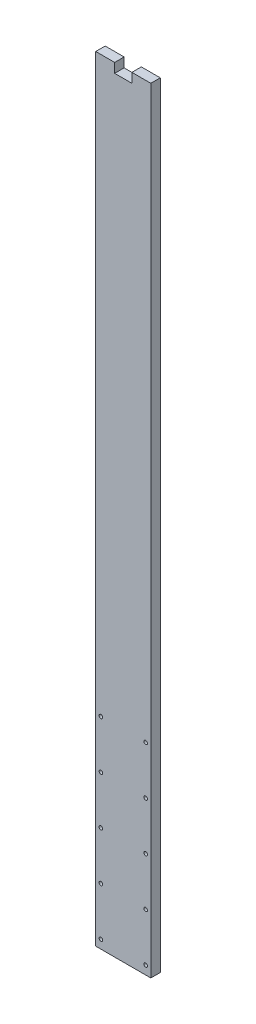
ISO-10303-21;
HEADER;
FILE_DESCRIPTION(('STEP AP214'),'2;1');
FILE_NAME('part.step','',(''),(''),'','','');
FILE_SCHEMA(('AUTOMOTIVE_DESIGN { 1 0 10303 214 1 1 1 1 }'));
ENDSEC;
DATA;
#1=APPLICATION_CONTEXT('core data for automotive mechanical design processes');
#2=APPLICATION_PROTOCOL_DEFINITION('international standard','automotive_design',2000,#1);
#3=PRODUCT_CONTEXT('',#1,'mechanical');
#4=PRODUCT('Part','Part','',(#3));
#5=PRODUCT_RELATED_PRODUCT_CATEGORY('part','',(#4));
#6=PRODUCT_DEFINITION_FORMATION('','',#4);
#7=PRODUCT_DEFINITION_CONTEXT('part definition',#1,'design');
#8=PRODUCT_DEFINITION('design','',#6,#7);
#9=PRODUCT_DEFINITION_SHAPE('','',#8);
#10=(LENGTH_UNIT() NAMED_UNIT(*) SI_UNIT(.MILLI.,.METRE.));
#11=(NAMED_UNIT(*) PLANE_ANGLE_UNIT() SI_UNIT($,.RADIAN.));
#12=(NAMED_UNIT(*) SI_UNIT($,.STERADIAN.) SOLID_ANGLE_UNIT());
#13=UNCERTAINTY_MEASURE_WITH_UNIT(LENGTH_MEASURE(1.E-05),#10,'distance_accuracy_value','');
#14=(GEOMETRIC_REPRESENTATION_CONTEXT(3) GLOBAL_UNCERTAINTY_ASSIGNED_CONTEXT((#13)) GLOBAL_UNIT_ASSIGNED_CONTEXT((#10,
#11,#12)) REPRESENTATION_CONTEXT('',''));
#15=CARTESIAN_POINT('',(0.,0.,0.));
#16=DIRECTION('',(0.,0.,1.));
#17=DIRECTION('',(1.,0.,0.));
#18=AXIS2_PLACEMENT_3D('',#15,#16,#17);
#19=CARTESIAN_POINT('',(0.,450.,5.5));
#20=DIRECTION('',(0.,-1.,0.));
#21=DIRECTION('',(0.,0.,-1.));
#22=AXIS2_PLACEMENT_3D('',#19,#20,#21);
#23=PLANE('',#22);
#24=DIRECTION('',(-1.,0.,0.));
#25=VECTOR('',#24,1.);
#26=CARTESIAN_POINT('',(0.,450.,0.));
#27=LINE('',#26,#25);
#28=CARTESIAN_POINT('',(32.,450.,0.));
#29=VERTEX_POINT('',#28);
#30=CARTESIAN_POINT('',(20.9999999999999,450.,0.));
#31=VERTEX_POINT('',#30);
#32=EDGE_CURVE('E126',#29,#31,#27,.T.);
#33=ORIENTED_EDGE('',*,*,#32,.T.);
#34=DIRECTION('',(0.,0.,1.));
#35=VECTOR('',#34,1.);
#36=CARTESIAN_POINT('',(20.9999999999999,450.,0.));
#37=LINE('',#36,#35);
#38=CARTESIAN_POINT('',(20.9999999999999,450.,5.5));
#39=VERTEX_POINT('',#38);
#40=EDGE_CURVE('E110',#31,#39,#37,.T.);
#41=ORIENTED_EDGE('',*,*,#40,.T.);
#42=DIRECTION('',(-1.,0.,0.));
#43=VECTOR('',#42,1.);
#44=CARTESIAN_POINT('',(0.,450.,5.5));
#45=LINE('',#44,#43);
#46=CARTESIAN_POINT('',(32.,450.,5.5));
#47=VERTEX_POINT('',#46);
#48=EDGE_CURVE('E143',#47,#39,#45,.T.);
#49=ORIENTED_EDGE('',*,*,#48,.F.);
#50=DIRECTION('',(0.,0.,-1.));
#51=VECTOR('',#50,1.);
#52=CARTESIAN_POINT('',(32.,450.,5.5));
#53=LINE('',#52,#51);
#54=EDGE_CURVE('E133',#47,#29,#53,.T.);
#55=ORIENTED_EDGE('',*,*,#54,.T.);
#56=EDGE_LOOP('',(#33,#41,#49,#55));
#57=FACE_BOUND('',#56,.T.);
#58=ADVANCED_FACE('F33',(#57),#23,.F.);
#59=CARTESIAN_POINT('',(0.,0.,5.5));
#60=DIRECTION('',(1.,0.,0.));
#61=DIRECTION('',(0.,0.,-1.));
#62=AXIS2_PLACEMENT_3D('',#59,#60,#61);
#63=PLANE('',#62);
#64=DIRECTION('',(0.,-1.,0.));
#65=VECTOR('',#64,1.);
#66=CARTESIAN_POINT('',(0.,0.,0.));
#67=LINE('',#66,#65);
#68=CARTESIAN_POINT('',(0.,450.,0.));
#69=VERTEX_POINT('',#68);
#70=CARTESIAN_POINT('',(0.,0.,0.));
#71=VERTEX_POINT('',#70);
#72=EDGE_CURVE('E189',#69,#71,#67,.T.);
#73=ORIENTED_EDGE('',*,*,#72,.T.);
#74=DIRECTION('',(0.,0.,-1.));
#75=VECTOR('',#74,1.);
#76=CARTESIAN_POINT('',(0.,0.,5.5));
#77=LINE('',#76,#75);
#78=CARTESIAN_POINT('',(0.,0.,5.5));
#79=VERTEX_POINT('',#78);
#80=EDGE_CURVE('E11',#79,#71,#77,.T.);
#81=ORIENTED_EDGE('',*,*,#80,.F.);
#82=DIRECTION('',(0.,-1.,0.));
#83=VECTOR('',#82,1.);
#84=CARTESIAN_POINT('',(0.,0.,5.5));
#85=LINE('',#84,#83);
#86=CARTESIAN_POINT('',(0.,450.,5.5));
#87=VERTEX_POINT('',#86);
#88=EDGE_CURVE('E134',#87,#79,#85,.T.);
#89=ORIENTED_EDGE('',*,*,#88,.F.);
#90=DIRECTION('',(0.,0.,-1.));
#91=VECTOR('',#90,1.);
#92=CARTESIAN_POINT('',(0.,450.,5.5));
#93=LINE('',#92,#91);
#94=EDGE_CURVE('E141',#87,#69,#93,.T.);
#95=ORIENTED_EDGE('',*,*,#94,.T.);
#96=EDGE_LOOP('',(#73,#81,#89,#95));
#97=FACE_BOUND('',#96,.T.);
#98=ADVANCED_FACE('F35',(#97),#63,.F.);
#99=CARTESIAN_POINT('',(0.,0.,5.5));
#100=DIRECTION('',(0.,1.,0.));
#101=DIRECTION('',(0.,0.,1.));
#102=AXIS2_PLACEMENT_3D('',#99,#100,#101);
#103=PLANE('',#102);
#104=DIRECTION('',(1.,0.,0.));
#105=VECTOR('',#104,1.);
#106=CARTESIAN_POINT('',(0.,0.,0.));
#107=LINE('',#106,#105);
#108=CARTESIAN_POINT('',(32.,0.,0.));
#109=VERTEX_POINT('',#108);
#110=EDGE_CURVE('E198',#71,#109,#107,.T.);
#111=ORIENTED_EDGE('',*,*,#110,.T.);
#112=DIRECTION('',(0.,0.,-1.));
#113=VECTOR('',#112,1.);
#114=CARTESIAN_POINT('',(32.,0.,5.5));
#115=LINE('',#114,#113);
#116=CARTESIAN_POINT('',(32.,0.,5.5));
#117=VERTEX_POINT('',#116);
#118=EDGE_CURVE('E42',#117,#109,#115,.T.);
#119=ORIENTED_EDGE('',*,*,#118,.F.);
#120=DIRECTION('',(1.,0.,0.));
#121=VECTOR('',#120,1.);
#122=CARTESIAN_POINT('',(0.,0.,5.5));
#123=LINE('',#122,#121);
#124=EDGE_CURVE('E88',#79,#117,#123,.T.);
#125=ORIENTED_EDGE('',*,*,#124,.F.);
#126=ORIENTED_EDGE('',*,*,#80,.T.);
#127=EDGE_LOOP('',(#111,#119,#125,#126));
#128=FACE_BOUND('',#127,.T.);
#129=ADVANCED_FACE('F204',(#128),#103,.F.);
#130=CARTESIAN_POINT('',(32.,0.,5.5));
#131=DIRECTION('',(-1.,0.,0.));
#132=DIRECTION('',(0.,0.,1.));
#133=AXIS2_PLACEMENT_3D('',#130,#131,#132);
#134=PLANE('',#133);
#135=DIRECTION('',(0.,1.,0.));
#136=VECTOR('',#135,1.);
#137=CARTESIAN_POINT('',(32.,0.,0.));
#138=LINE('',#137,#136);
#139=EDGE_CURVE('E137',#109,#29,#138,.T.);
#140=ORIENTED_EDGE('',*,*,#139,.T.);
#141=ORIENTED_EDGE('',*,*,#54,.F.);
#142=DIRECTION('',(0.,1.,0.));
#143=VECTOR('',#142,1.);
#144=CARTESIAN_POINT('',(32.,0.,5.5));
#145=LINE('',#144,#143);
#146=EDGE_CURVE('E194',#117,#47,#145,.T.);
#147=ORIENTED_EDGE('',*,*,#146,.F.);
#148=ORIENTED_EDGE('',*,*,#118,.T.);
#149=EDGE_LOOP('',(#140,#141,#147,#148));
#150=FACE_BOUND('',#149,.T.);
#151=ADVANCED_FACE('F200',(#150),#134,.F.);
#152=CARTESIAN_POINT('',(10.9999999999999,450.,5.5));
#153=VERTEX_POINT('',#152);
#154=EDGE_CURVE('E59',#153,#87,#45,.T.);
#155=ORIENTED_EDGE('',*,*,#154,.F.);
#156=DIRECTION('',(0.,0.,1.));
#157=VECTOR('',#156,1.);
#158=CARTESIAN_POINT('',(10.9999999999999,450.,0.));
#159=LINE('',#158,#157);
#160=CARTESIAN_POINT('',(10.9999999999999,450.,0.));
#161=VERTEX_POINT('',#160);
#162=EDGE_CURVE('E120',#161,#153,#159,.T.);
#163=ORIENTED_EDGE('',*,*,#162,.F.);
#164=EDGE_CURVE('E81',#161,#69,#27,.T.);
#165=ORIENTED_EDGE('',*,*,#164,.T.);
#166=ORIENTED_EDGE('',*,*,#94,.F.);
#167=EDGE_LOOP('',(#155,#163,#165,#166));
#168=FACE_BOUND('',#167,.T.);
#169=ADVANCED_FACE('F207',(#168),#23,.F.);
#170=CARTESIAN_POINT('',(0.,0.,5.5));
#171=DIRECTION('',(0.,0.,-1.));
#172=DIRECTION('',(-1.,0.,0.));
#173=AXIS2_PLACEMENT_3D('',#170,#171,#172);
#174=PLANE('',#173);
#175=CARTESIAN_POINT('',(29.,61.,5.5));
#176=DIRECTION('',(0.,0.,1.));
#177=DIRECTION('',(1.,0.,0.));
#178=AXIS2_PLACEMENT_3D('',#175,#176,#177);
#179=CIRCLE('',#178,1.05);
#180=CARTESIAN_POINT('',(30.05,61.,5.5));
#181=VERTEX_POINT('',#180);
#182=EDGE_CURVE('E222',#181,#181,#179,.T.);
#183=ORIENTED_EDGE('',*,*,#182,.F.);
#184=EDGE_LOOP('',(#183));
#185=FACE_BOUND('',#184,.T.);
#186=CARTESIAN_POINT('',(3.,89.,5.5));
#187=DIRECTION('',(0.,0.,1.));
#188=DIRECTION('',(1.,0.,0.));
#189=AXIS2_PLACEMENT_3D('',#186,#187,#188);
#190=CIRCLE('',#189,1.05);
#191=CARTESIAN_POINT('',(4.05,89.,5.5));
#192=VERTEX_POINT('',#191);
#193=EDGE_CURVE('E225',#192,#192,#190,.T.);
#194=ORIENTED_EDGE('',*,*,#193,.F.);
#195=EDGE_LOOP('',(#194));
#196=FACE_BOUND('',#195,.T.);
#197=CARTESIAN_POINT('',(29.,89.,5.5));
#198=DIRECTION('',(0.,0.,1.));
#199=DIRECTION('',(1.,0.,0.));
#200=AXIS2_PLACEMENT_3D('',#197,#198,#199);
#201=CIRCLE('',#200,1.05);
#202=CARTESIAN_POINT('',(30.05,89.,5.5));
#203=VERTEX_POINT('',#202);
#204=EDGE_CURVE('E228',#203,#203,#201,.T.);
#205=ORIENTED_EDGE('',*,*,#204,.F.);
#206=EDGE_LOOP('',(#205));
#207=FACE_BOUND('',#206,.T.);
#208=CARTESIAN_POINT('',(3.,117.,5.5));
#209=DIRECTION('',(0.,0.,1.));
#210=DIRECTION('',(1.,0.,0.));
#211=AXIS2_PLACEMENT_3D('',#208,#209,#210);
#212=CIRCLE('',#211,1.05);
#213=CARTESIAN_POINT('',(4.05,117.,5.5));
#214=VERTEX_POINT('',#213);
#215=EDGE_CURVE('E231',#214,#214,#212,.T.);
#216=ORIENTED_EDGE('',*,*,#215,.F.);
#217=EDGE_LOOP('',(#216));
#218=FACE_BOUND('',#217,.T.);
#219=CARTESIAN_POINT('',(29.,5.,5.5));
#220=DIRECTION('',(0.,0.,1.));
#221=DIRECTION('',(1.,0.,0.));
#222=AXIS2_PLACEMENT_3D('',#219,#220,#221);
#223=CIRCLE('',#222,1.05);
#224=CARTESIAN_POINT('',(30.05,5.,5.5));
#225=VERTEX_POINT('',#224);
#226=EDGE_CURVE('E212',#225,#225,#223,.T.);
#227=ORIENTED_EDGE('',*,*,#226,.F.);
#228=EDGE_LOOP('',(#227));
#229=FACE_BOUND('',#228,.T.);
#230=CARTESIAN_POINT('',(3.,33.,5.5));
#231=DIRECTION('',(0.,0.,1.));
#232=DIRECTION('',(1.,0.,0.));
#233=AXIS2_PLACEMENT_3D('',#230,#231,#232);
#234=CIRCLE('',#233,1.05);
#235=CARTESIAN_POINT('',(4.05,33.,5.5));
#236=VERTEX_POINT('',#235);
#237=EDGE_CURVE('E213',#236,#236,#234,.T.);
#238=ORIENTED_EDGE('',*,*,#237,.F.);
#239=EDGE_LOOP('',(#238));
#240=FACE_BOUND('',#239,.T.);
#241=CARTESIAN_POINT('',(29.,33.,5.5));
#242=DIRECTION('',(0.,0.,1.));
#243=DIRECTION('',(1.,0.,0.));
#244=AXIS2_PLACEMENT_3D('',#241,#242,#243);
#245=CIRCLE('',#244,1.05);
#246=CARTESIAN_POINT('',(30.05,33.,5.5));
#247=VERTEX_POINT('',#246);
#248=EDGE_CURVE('E216',#247,#247,#245,.T.);
#249=ORIENTED_EDGE('',*,*,#248,.F.);
#250=EDGE_LOOP('',(#249));
#251=FACE_BOUND('',#250,.T.);
#252=CARTESIAN_POINT('',(3.,61.,5.5));
#253=DIRECTION('',(0.,0.,1.));
#254=DIRECTION('',(1.,0.,0.));
#255=AXIS2_PLACEMENT_3D('',#252,#253,#254);
#256=CIRCLE('',#255,1.05);
#257=CARTESIAN_POINT('',(4.05,61.,5.5));
#258=VERTEX_POINT('',#257);
#259=EDGE_CURVE('E219',#258,#258,#256,.T.);
#260=ORIENTED_EDGE('',*,*,#259,.F.);
#261=EDGE_LOOP('',(#260));
#262=FACE_BOUND('',#261,.T.);
#263=CARTESIAN_POINT('',(29.,117.,5.5));
#264=DIRECTION('',(0.,0.,1.));
#265=DIRECTION('',(1.,0.,0.));
#266=AXIS2_PLACEMENT_3D('',#263,#264,#265);
#267=CIRCLE('',#266,1.05);
#268=CARTESIAN_POINT('',(30.05,117.,5.5));
#269=VERTEX_POINT('',#268);
#270=EDGE_CURVE('E234',#269,#269,#267,.T.);
#271=ORIENTED_EDGE('',*,*,#270,.F.);
#272=EDGE_LOOP('',(#271));
#273=FACE_BOUND('',#272,.T.);
#274=CARTESIAN_POINT('',(3.,5.,5.5));
#275=DIRECTION('',(0.,0.,1.));
#276=DIRECTION('',(1.,0.,0.));
#277=AXIS2_PLACEMENT_3D('',#274,#275,#276);
#278=CIRCLE('',#277,1.05);
#279=CARTESIAN_POINT('',(4.05,5.,5.5));
#280=VERTEX_POINT('',#279);
#281=EDGE_CURVE('E151',#280,#280,#278,.T.);
#282=ORIENTED_EDGE('',*,*,#281,.F.);
#283=EDGE_LOOP('',(#282));
#284=FACE_BOUND('',#283,.T.);
#285=ORIENTED_EDGE('',*,*,#48,.T.);
#286=DIRECTION('',(0.,1.,0.));
#287=VECTOR('',#286,1.);
#288=CARTESIAN_POINT('',(20.9999999999999,444.5,5.5));
#289=LINE('',#288,#287);
#290=CARTESIAN_POINT('',(20.9999999999999,444.5,5.5));
#291=VERTEX_POINT('',#290);
#292=EDGE_CURVE('E115',#291,#39,#289,.T.);
#293=ORIENTED_EDGE('',*,*,#292,.F.);
#294=DIRECTION('',(1.,0.,0.));
#295=VECTOR('',#294,1.);
#296=CARTESIAN_POINT('',(10.9999999999999,444.5,5.5));
#297=LINE('',#296,#295);
#298=CARTESIAN_POINT('',(10.9999999999999,444.5,5.5));
#299=VERTEX_POINT('',#298);
#300=EDGE_CURVE('E129',#299,#291,#297,.T.);
#301=ORIENTED_EDGE('',*,*,#300,.F.);
#302=DIRECTION('',(0.,-1.,0.));
#303=VECTOR('',#302,1.);
#304=CARTESIAN_POINT('',(10.9999999999999,444.5,5.5));
#305=LINE('',#304,#303);
#306=EDGE_CURVE('E178',#153,#299,#305,.T.);
#307=ORIENTED_EDGE('',*,*,#306,.F.);
#308=ORIENTED_EDGE('',*,*,#154,.T.);
#309=ORIENTED_EDGE('',*,*,#88,.T.);
#310=ORIENTED_EDGE('',*,*,#124,.T.);
#311=ORIENTED_EDGE('',*,*,#146,.T.);
#312=EDGE_LOOP('',(#285,#293,#301,#307,#308,#309,#310,#311));
#313=FACE_BOUND('',#312,.T.);
#314=ADVANCED_FACE('F242',(#185,#196,#207,#218,#229,#240,#251,#262,#273,#284,#313),#174,.F.);
#315=CARTESIAN_POINT('',(0.,0.,0.));
#316=DIRECTION('',(0.,0.,-1.));
#317=DIRECTION('',(-1.,0.,0.));
#318=AXIS2_PLACEMENT_3D('',#315,#316,#317);
#319=PLANE('',#318);
#320=CARTESIAN_POINT('',(29.,61.,0.));
#321=DIRECTION('',(0.,0.,-1.));
#322=DIRECTION('',(-1.,0.,0.));
#323=AXIS2_PLACEMENT_3D('',#320,#321,#322);
#324=CIRCLE('',#323,1.05);
#325=CARTESIAN_POINT('',(27.95,61.,0.));
#326=VERTEX_POINT('',#325);
#327=EDGE_CURVE('E37',#326,#326,#324,.T.);
#328=ORIENTED_EDGE('',*,*,#327,.F.);
#329=EDGE_LOOP('',(#328));
#330=FACE_BOUND('',#329,.T.);
#331=CARTESIAN_POINT('',(3.,89.,0.));
#332=DIRECTION('',(0.,0.,-1.));
#333=DIRECTION('',(-1.,0.,0.));
#334=AXIS2_PLACEMENT_3D('',#331,#332,#333);
#335=CIRCLE('',#334,1.05);
#336=CARTESIAN_POINT('',(1.95,89.,0.));
#337=VERTEX_POINT('',#336);
#338=EDGE_CURVE('E171',#337,#337,#335,.T.);
#339=ORIENTED_EDGE('',*,*,#338,.F.);
#340=EDGE_LOOP('',(#339));
#341=FACE_BOUND('',#340,.T.);
#342=CARTESIAN_POINT('',(29.,89.,0.));
#343=DIRECTION('',(0.,0.,-1.));
#344=DIRECTION('',(-1.,0.,0.));
#345=AXIS2_PLACEMENT_3D('',#342,#343,#344);
#346=CIRCLE('',#345,1.05);
#347=CARTESIAN_POINT('',(27.95,89.,0.));
#348=VERTEX_POINT('',#347);
#349=EDGE_CURVE('E169',#348,#348,#346,.T.);
#350=ORIENTED_EDGE('',*,*,#349,.F.);
#351=EDGE_LOOP('',(#350));
#352=FACE_BOUND('',#351,.T.);
#353=CARTESIAN_POINT('',(3.,117.,0.));
#354=DIRECTION('',(0.,0.,-1.));
#355=DIRECTION('',(-1.,0.,0.));
#356=AXIS2_PLACEMENT_3D('',#353,#354,#355);
#357=CIRCLE('',#356,1.05);
#358=CARTESIAN_POINT('',(1.95,117.,0.));
#359=VERTEX_POINT('',#358);
#360=EDGE_CURVE('E166',#359,#359,#357,.T.);
#361=ORIENTED_EDGE('',*,*,#360,.F.);
#362=EDGE_LOOP('',(#361));
#363=FACE_BOUND('',#362,.T.);
#364=CARTESIAN_POINT('',(29.,5.,0.));
#365=DIRECTION('',(0.,0.,-1.));
#366=DIRECTION('',(-1.,0.,0.));
#367=AXIS2_PLACEMENT_3D('',#364,#365,#366);
#368=CIRCLE('',#367,1.05);
#369=CARTESIAN_POINT('',(27.95,5.,0.));
#370=VERTEX_POINT('',#369);
#371=EDGE_CURVE('E163',#370,#370,#368,.T.);
#372=ORIENTED_EDGE('',*,*,#371,.F.);
#373=EDGE_LOOP('',(#372));
#374=FACE_BOUND('',#373,.T.);
#375=CARTESIAN_POINT('',(3.,33.,0.));
#376=DIRECTION('',(0.,0.,-1.));
#377=DIRECTION('',(-1.,0.,0.));
#378=AXIS2_PLACEMENT_3D('',#375,#376,#377);
#379=CIRCLE('',#378,1.05);
#380=CARTESIAN_POINT('',(1.95,33.,0.));
#381=VERTEX_POINT('',#380);
#382=EDGE_CURVE('E160',#381,#381,#379,.T.);
#383=ORIENTED_EDGE('',*,*,#382,.F.);
#384=EDGE_LOOP('',(#383));
#385=FACE_BOUND('',#384,.T.);
#386=CARTESIAN_POINT('',(29.,33.,0.));
#387=DIRECTION('',(0.,0.,-1.));
#388=DIRECTION('',(-1.,0.,0.));
#389=AXIS2_PLACEMENT_3D('',#386,#387,#388);
#390=CIRCLE('',#389,1.05);
#391=CARTESIAN_POINT('',(27.95,33.,0.));
#392=VERTEX_POINT('',#391);
#393=EDGE_CURVE('E157',#392,#392,#390,.T.);
#394=ORIENTED_EDGE('',*,*,#393,.F.);
#395=EDGE_LOOP('',(#394));
#396=FACE_BOUND('',#395,.T.);
#397=CARTESIAN_POINT('',(3.,61.,0.));
#398=DIRECTION('',(0.,0.,-1.));
#399=DIRECTION('',(-1.,0.,0.));
#400=AXIS2_PLACEMENT_3D('',#397,#398,#399);
#401=CIRCLE('',#400,1.05);
#402=CARTESIAN_POINT('',(1.95,61.,0.));
#403=VERTEX_POINT('',#402);
#404=EDGE_CURVE('E154',#403,#403,#401,.T.);
#405=ORIENTED_EDGE('',*,*,#404,.F.);
#406=EDGE_LOOP('',(#405));
#407=FACE_BOUND('',#406,.T.);
#408=CARTESIAN_POINT('',(29.,117.,0.));
#409=DIRECTION('',(0.,0.,-1.));
#410=DIRECTION('',(-1.,0.,0.));
#411=AXIS2_PLACEMENT_3D('',#408,#409,#410);
#412=CIRCLE('',#411,1.05);
#413=CARTESIAN_POINT('',(27.95,117.,0.));
#414=VERTEX_POINT('',#413);
#415=EDGE_CURVE('E150',#414,#414,#412,.T.);
#416=ORIENTED_EDGE('',*,*,#415,.F.);
#417=EDGE_LOOP('',(#416));
#418=FACE_BOUND('',#417,.T.);
#419=CARTESIAN_POINT('',(3.,5.,0.));
#420=DIRECTION('',(0.,0.,-1.));
#421=DIRECTION('',(-1.,0.,0.));
#422=AXIS2_PLACEMENT_3D('',#419,#420,#421);
#423=CIRCLE('',#422,1.05);
#424=CARTESIAN_POINT('',(1.95,5.,0.));
#425=VERTEX_POINT('',#424);
#426=EDGE_CURVE('E147',#425,#425,#423,.T.);
#427=ORIENTED_EDGE('',*,*,#426,.F.);
#428=EDGE_LOOP('',(#427));
#429=FACE_BOUND('',#428,.T.);
#430=DIRECTION('',(0.,1.,0.));
#431=VECTOR('',#430,1.);
#432=CARTESIAN_POINT('',(20.9999999999999,444.5,0.));
#433=LINE('',#432,#431);
#434=CARTESIAN_POINT('',(20.9999999999999,444.5,0.));
#435=VERTEX_POINT('',#434);
#436=EDGE_CURVE('E113',#435,#31,#433,.T.);
#437=ORIENTED_EDGE('',*,*,#436,.T.);
#438=ORIENTED_EDGE('',*,*,#32,.F.);
#439=ORIENTED_EDGE('',*,*,#139,.F.);
#440=ORIENTED_EDGE('',*,*,#110,.F.);
#441=ORIENTED_EDGE('',*,*,#72,.F.);
#442=ORIENTED_EDGE('',*,*,#164,.F.);
#443=DIRECTION('',(0.,-1.,0.));
#444=VECTOR('',#443,1.);
#445=CARTESIAN_POINT('',(10.9999999999999,444.5,0.));
#446=LINE('',#445,#444);
#447=CARTESIAN_POINT('',(10.9999999999999,444.5,0.));
#448=VERTEX_POINT('',#447);
#449=EDGE_CURVE('E128',#161,#448,#446,.T.);
#450=ORIENTED_EDGE('',*,*,#449,.T.);
#451=DIRECTION('',(1.,0.,0.));
#452=VECTOR('',#451,1.);
#453=CARTESIAN_POINT('',(10.9999999999999,444.5,0.));
#454=LINE('',#453,#452);
#455=EDGE_CURVE('E50',#448,#435,#454,.T.);
#456=ORIENTED_EDGE('',*,*,#455,.T.);
#457=EDGE_LOOP('',(#437,#438,#439,#440,#441,#442,#450,#456));
#458=FACE_BOUND('',#457,.T.);
#459=ADVANCED_FACE('F124',(#330,#341,#352,#363,#374,#385,#396,#407,#418,#429,#458),#319,.T.);
#460=CARTESIAN_POINT('',(20.9999999999999,444.5,0.));
#461=DIRECTION('',(1.,0.,0.));
#462=DIRECTION('',(0.,1.,0.));
#463=AXIS2_PLACEMENT_3D('',#460,#461,#462);
#464=PLANE('',#463);
#465=ORIENTED_EDGE('',*,*,#292,.T.);
#466=ORIENTED_EDGE('',*,*,#40,.F.);
#467=ORIENTED_EDGE('',*,*,#436,.F.);
#468=DIRECTION('',(0.,0.,1.));
#469=VECTOR('',#468,1.);
#470=CARTESIAN_POINT('',(20.9999999999999,444.5,0.));
#471=LINE('',#470,#469);
#472=EDGE_CURVE('E187',#435,#291,#471,.T.);
#473=ORIENTED_EDGE('',*,*,#472,.T.);
#474=EDGE_LOOP('',(#465,#466,#467,#473));
#475=FACE_BOUND('',#474,.T.);
#476=ADVANCED_FACE('F112',(#475),#464,.F.);
#477=CARTESIAN_POINT('',(10.9999999999999,444.5,0.));
#478=DIRECTION('',(0.,-1.,0.));
#479=DIRECTION('',(0.,0.,-1.));
#480=AXIS2_PLACEMENT_3D('',#477,#478,#479);
#481=PLANE('',#480);
#482=ORIENTED_EDGE('',*,*,#300,.T.);
#483=ORIENTED_EDGE('',*,*,#472,.F.);
#484=ORIENTED_EDGE('',*,*,#455,.F.);
#485=DIRECTION('',(0.,0.,1.));
#486=VECTOR('',#485,1.);
#487=CARTESIAN_POINT('',(10.9999999999999,444.5,0.));
#488=LINE('',#487,#486);
#489=EDGE_CURVE('E190',#448,#299,#488,.T.);
#490=ORIENTED_EDGE('',*,*,#489,.T.);
#491=EDGE_LOOP('',(#482,#483,#484,#490));
#492=FACE_BOUND('',#491,.T.);
#493=ADVANCED_FACE('F249',(#492),#481,.F.);
#494=CARTESIAN_POINT('',(10.9999999999999,444.5,0.));
#495=DIRECTION('',(-1.,0.,0.));
#496=DIRECTION('',(0.,0.,1.));
#497=AXIS2_PLACEMENT_3D('',#494,#495,#496);
#498=PLANE('',#497);
#499=ORIENTED_EDGE('',*,*,#306,.T.);
#500=ORIENTED_EDGE('',*,*,#489,.F.);
#501=ORIENTED_EDGE('',*,*,#449,.F.);
#502=ORIENTED_EDGE('',*,*,#162,.T.);
#503=EDGE_LOOP('',(#499,#500,#501,#502));
#504=FACE_BOUND('',#503,.T.);
#505=ADVANCED_FACE('F250',(#504),#498,.F.);
#506=CARTESIAN_POINT('',(3.,5.,-4.5));
#507=DIRECTION('',(0.,0.,1.));
#508=DIRECTION('',(1.,0.,0.));
#509=AXIS2_PLACEMENT_3D('',#506,#507,#508);
#510=CYLINDRICAL_SURFACE('',#509,1.05);
#511=ORIENTED_EDGE('',*,*,#426,.T.);
#512=EDGE_LOOP('',(#511));
#513=FACE_BOUND('',#512,.T.);
#514=ORIENTED_EDGE('',*,*,#281,.T.);
#515=EDGE_LOOP('',(#514));
#516=FACE_BOUND('',#515,.T.);
#517=ADVANCED_FACE('F252',(#513,#516),#510,.F.);
#518=CARTESIAN_POINT('',(29.,117.,-4.5));
#519=DIRECTION('',(0.,0.,1.));
#520=DIRECTION('',(1.,0.,0.));
#521=AXIS2_PLACEMENT_3D('',#518,#519,#520);
#522=CYLINDRICAL_SURFACE('',#521,1.05);
#523=ORIENTED_EDGE('',*,*,#415,.T.);
#524=EDGE_LOOP('',(#523));
#525=FACE_BOUND('',#524,.T.);
#526=ORIENTED_EDGE('',*,*,#270,.T.);
#527=EDGE_LOOP('',(#526));
#528=FACE_BOUND('',#527,.T.);
#529=ADVANCED_FACE('F240',(#525,#528),#522,.F.);
#530=CARTESIAN_POINT('',(3.,61.,-4.5));
#531=DIRECTION('',(0.,0.,1.));
#532=DIRECTION('',(1.,0.,0.));
#533=AXIS2_PLACEMENT_3D('',#530,#531,#532);
#534=CYLINDRICAL_SURFACE('',#533,1.05);
#535=ORIENTED_EDGE('',*,*,#404,.T.);
#536=EDGE_LOOP('',(#535));
#537=FACE_BOUND('',#536,.T.);
#538=ORIENTED_EDGE('',*,*,#259,.T.);
#539=EDGE_LOOP('',(#538));
#540=FACE_BOUND('',#539,.T.);
#541=ADVANCED_FACE('F338',(#537,#540),#534,.F.);
#542=CARTESIAN_POINT('',(29.,33.,-4.5));
#543=DIRECTION('',(0.,0.,1.));
#544=DIRECTION('',(1.,0.,0.));
#545=AXIS2_PLACEMENT_3D('',#542,#543,#544);
#546=CYLINDRICAL_SURFACE('',#545,1.05);
#547=ORIENTED_EDGE('',*,*,#393,.T.);
#548=EDGE_LOOP('',(#547));
#549=FACE_BOUND('',#548,.T.);
#550=ORIENTED_EDGE('',*,*,#248,.T.);
#551=EDGE_LOOP('',(#550));
#552=FACE_BOUND('',#551,.T.);
#553=ADVANCED_FACE('F347',(#549,#552),#546,.F.);
#554=CARTESIAN_POINT('',(3.,33.,-4.5));
#555=DIRECTION('',(0.,0.,1.));
#556=DIRECTION('',(1.,0.,0.));
#557=AXIS2_PLACEMENT_3D('',#554,#555,#556);
#558=CYLINDRICAL_SURFACE('',#557,1.05);
#559=ORIENTED_EDGE('',*,*,#382,.T.);
#560=EDGE_LOOP('',(#559));
#561=FACE_BOUND('',#560,.T.);
#562=ORIENTED_EDGE('',*,*,#237,.T.);
#563=EDGE_LOOP('',(#562));
#564=FACE_BOUND('',#563,.T.);
#565=ADVANCED_FACE('F356',(#561,#564),#558,.F.);
#566=CARTESIAN_POINT('',(29.,5.,-4.5));
#567=DIRECTION('',(0.,0.,1.));
#568=DIRECTION('',(1.,0.,0.));
#569=AXIS2_PLACEMENT_3D('',#566,#567,#568);
#570=CYLINDRICAL_SURFACE('',#569,1.05);
#571=ORIENTED_EDGE('',*,*,#371,.T.);
#572=EDGE_LOOP('',(#571));
#573=FACE_BOUND('',#572,.T.);
#574=ORIENTED_EDGE('',*,*,#226,.T.);
#575=EDGE_LOOP('',(#574));
#576=FACE_BOUND('',#575,.T.);
#577=ADVANCED_FACE('F365',(#573,#576),#570,.F.);
#578=CARTESIAN_POINT('',(3.,117.,-4.5));
#579=DIRECTION('',(0.,0.,1.));
#580=DIRECTION('',(1.,0.,0.));
#581=AXIS2_PLACEMENT_3D('',#578,#579,#580);
#582=CYLINDRICAL_SURFACE('',#581,1.05);
#583=ORIENTED_EDGE('',*,*,#360,.T.);
#584=EDGE_LOOP('',(#583));
#585=FACE_BOUND('',#584,.T.);
#586=ORIENTED_EDGE('',*,*,#215,.T.);
#587=EDGE_LOOP('',(#586));
#588=FACE_BOUND('',#587,.T.);
#589=ADVANCED_FACE('F374',(#585,#588),#582,.F.);
#590=CARTESIAN_POINT('',(29.,89.,-4.5));
#591=DIRECTION('',(0.,0.,1.));
#592=DIRECTION('',(1.,0.,0.));
#593=AXIS2_PLACEMENT_3D('',#590,#591,#592);
#594=CYLINDRICAL_SURFACE('',#593,1.05);
#595=ORIENTED_EDGE('',*,*,#349,.T.);
#596=EDGE_LOOP('',(#595));
#597=FACE_BOUND('',#596,.T.);
#598=ORIENTED_EDGE('',*,*,#204,.T.);
#599=EDGE_LOOP('',(#598));
#600=FACE_BOUND('',#599,.T.);
#601=ADVANCED_FACE('F383',(#597,#600),#594,.F.);
#602=CARTESIAN_POINT('',(3.,89.,-4.5));
#603=DIRECTION('',(0.,0.,1.));
#604=DIRECTION('',(1.,0.,0.));
#605=AXIS2_PLACEMENT_3D('',#602,#603,#604);
#606=CYLINDRICAL_SURFACE('',#605,1.05);
#607=ORIENTED_EDGE('',*,*,#338,.T.);
#608=EDGE_LOOP('',(#607));
#609=FACE_BOUND('',#608,.T.);
#610=ORIENTED_EDGE('',*,*,#193,.T.);
#611=EDGE_LOOP('',(#610));
#612=FACE_BOUND('',#611,.T.);
#613=ADVANCED_FACE('F392',(#609,#612),#606,.F.);
#614=CARTESIAN_POINT('',(29.,61.,-4.5));
#615=DIRECTION('',(0.,0.,1.));
#616=DIRECTION('',(1.,0.,0.));
#617=AXIS2_PLACEMENT_3D('',#614,#615,#616);
#618=CYLINDRICAL_SURFACE('',#617,1.05);
#619=ORIENTED_EDGE('',*,*,#327,.T.);
#620=EDGE_LOOP('',(#619));
#621=FACE_BOUND('',#620,.T.);
#622=ORIENTED_EDGE('',*,*,#182,.T.);
#623=EDGE_LOOP('',(#622));
#624=FACE_BOUND('',#623,.T.);
#625=ADVANCED_FACE('F401',(#621,#624),#618,.F.);
#626=CLOSED_SHELL('',(#58,#98,#129,#151,#169,#314,#459,#476,#493,#505,#517,#529,#541,#553,#565,
#577,#589,#601,#613,#625));
#627=MANIFOLD_SOLID_BREP('B2',#626);
#628=ADVANCED_BREP_SHAPE_REPRESENTATION('',(#18,#627),#14);
#629=SHAPE_DEFINITION_REPRESENTATION(#9,#628);
ENDSEC;
END-ISO-10303-21;
